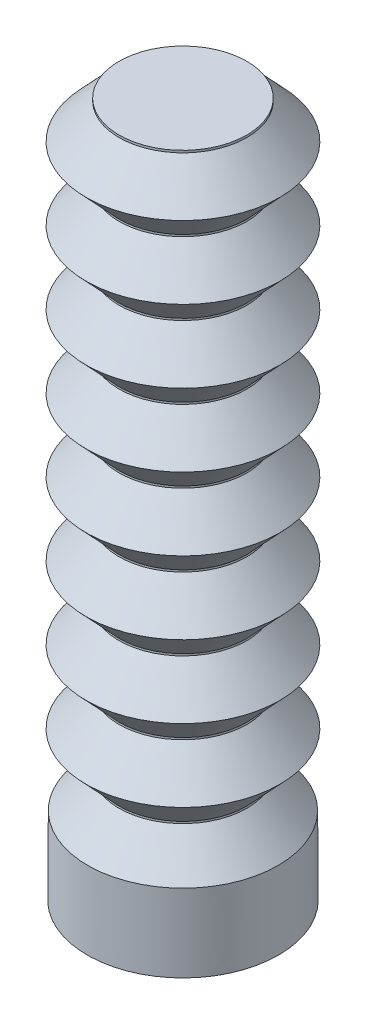
ISO-10303-21;
HEADER;
FILE_DESCRIPTION(('STEP AP214'),'2;1');
FILE_NAME('part.step','',(''),(''),'','','');
FILE_SCHEMA(('AUTOMOTIVE_DESIGN { 1 0 10303 214 1 1 1 1 }'));
ENDSEC;
DATA;
#1=APPLICATION_CONTEXT('core data for automotive mechanical design processes');
#2=APPLICATION_PROTOCOL_DEFINITION('international standard','automotive_design',2000,#1);
#3=PRODUCT_CONTEXT('',#1,'mechanical');
#4=PRODUCT('Part','Part','',(#3));
#5=PRODUCT_RELATED_PRODUCT_CATEGORY('part','',(#4));
#6=PRODUCT_DEFINITION_FORMATION('','',#4);
#7=PRODUCT_DEFINITION_CONTEXT('part definition',#1,'design');
#8=PRODUCT_DEFINITION('design','',#6,#7);
#9=PRODUCT_DEFINITION_SHAPE('','',#8);
#10=(LENGTH_UNIT() NAMED_UNIT(*) SI_UNIT(.MILLI.,.METRE.));
#11=(NAMED_UNIT(*) PLANE_ANGLE_UNIT() SI_UNIT($,.RADIAN.));
#12=(NAMED_UNIT(*) SI_UNIT($,.STERADIAN.) SOLID_ANGLE_UNIT());
#13=UNCERTAINTY_MEASURE_WITH_UNIT(LENGTH_MEASURE(1.E-05),#10,'distance_accuracy_value','');
#14=(GEOMETRIC_REPRESENTATION_CONTEXT(3) GLOBAL_UNCERTAINTY_ASSIGNED_CONTEXT((#13)) GLOBAL_UNIT_ASSIGNED_CONTEXT((#10,
#11,#12)) REPRESENTATION_CONTEXT('',''));
#15=CARTESIAN_POINT('',(0.,0.,0.));
#16=DIRECTION('',(0.,0.,1.));
#17=DIRECTION('',(1.,0.,0.));
#18=AXIS2_PLACEMENT_3D('',#15,#16,#17);
#19=CARTESIAN_POINT('',(-0.490246862964917,-1.75443319236906,0.));
#20=DIRECTION('',(0.,1.,0.));
#21=DIRECTION('',(-1.,0.,0.));
#22=AXIS2_PLACEMENT_3D('',#19,#20,#21);
#23=PLANE('',#22);
#24=CARTESIAN_POINT('',(-5.43163068128709,-1.75443319236906,0.));
#25=DIRECTION('',(0.,-1.,0.));
#26=DIRECTION('',(1.,0.,0.));
#27=AXIS2_PLACEMENT_3D('',#24,#25,#26);
#28=CIRCLE('',#27,4.94138381832217);
#29=CARTESIAN_POINT('',(-0.490246862964917,-1.75443319236906,0.));
#30=VERTEX_POINT('',#29);
#31=EDGE_CURVE('E50',#30,#30,#28,.T.);
#32=ORIENTED_EDGE('',*,*,#31,.T.);
#33=EDGE_LOOP('',(#32));
#34=FACE_BOUND('',#33,.T.);
#35=ADVANCED_FACE('F32',(#34),#23,.F.);
#36=CARTESIAN_POINT('',(-5.43163068128709,2.24550168514075,0.));
#37=DIRECTION('',(0.,-1.,0.));
#38=DIRECTION('',(1.,0.,0.));
#39=AXIS2_PLACEMENT_3D('',#36,#37,#38);
#40=CONICAL_SURFACE('',#39,4.91855892663377,0.00570625388925565);
#41=ORIENTED_EDGE('',*,*,#31,.F.);
#42=EDGE_LOOP('',(#41));
#43=FACE_BOUND('',#42,.T.);
#44=CARTESIAN_POINT('',(-5.43163068128709,2.24550168514075,0.));
#45=DIRECTION('',(0.,-1.,0.));
#46=DIRECTION('',(1.,0.,0.));
#47=AXIS2_PLACEMENT_3D('',#44,#45,#46);
#48=CIRCLE('',#47,4.91855892663377);
#49=CARTESIAN_POINT('',(-0.513071754653318,2.24550168514075,0.));
#50=VERTEX_POINT('',#49);
#51=EDGE_CURVE('E53',#50,#50,#48,.T.);
#52=ORIENTED_EDGE('',*,*,#51,.T.);
#53=EDGE_LOOP('',(#52));
#54=FACE_BOUND('',#53,.T.);
#55=ADVANCED_FACE('F241',(#43,#54),#40,.T.);
#56=CARTESIAN_POINT('',(-5.43163068128709,3.98840953088229,0.));
#57=DIRECTION('',(0.,-1.,0.));
#58=DIRECTION('',(1.,0.,0.));
#59=AXIS2_PLACEMENT_3D('',#56,#57,#58);
#60=CONICAL_SURFACE('',#59,3.30000000000031,0.74842256535505);
#61=ORIENTED_EDGE('',*,*,#51,.F.);
#62=EDGE_LOOP('',(#61));
#63=FACE_BOUND('',#62,.T.);
#64=CARTESIAN_POINT('',(-5.43163068128709,3.98840953088229,0.));
#65=DIRECTION('',(0.,-1.,0.));
#66=DIRECTION('',(1.,0.,0.));
#67=AXIS2_PLACEMENT_3D('',#64,#65,#66);
#68=CIRCLE('',#67,3.30000000000031);
#69=CARTESIAN_POINT('',(-2.13163068128678,3.98840953088229,0.));
#70=VERTEX_POINT('',#69);
#71=EDGE_CURVE('E56',#70,#70,#68,.T.);
#72=ORIENTED_EDGE('',*,*,#71,.T.);
#73=EDGE_LOOP('',(#72));
#74=FACE_BOUND('',#73,.T.);
#75=ADVANCED_FACE('F245',(#63,#74),#60,.T.);
#76=CARTESIAN_POINT('',(-5.43163068128709,34.1029540037317,0.));
#77=DIRECTION('',(0.,-1.,0.));
#78=DIRECTION('',(1.,0.,0.));
#79=AXIS2_PLACEMENT_3D('',#76,#77,#78);
#80=CYLINDRICAL_SURFACE('',#79,3.30000000000029);
#81=ORIENTED_EDGE('',*,*,#71,.F.);
#82=EDGE_LOOP('',(#81));
#83=FACE_BOUND('',#82,.T.);
#84=CARTESIAN_POINT('',(-5.43163068128709,4.08840953088234,0.));
#85=DIRECTION('',(0.,-1.,0.));
#86=DIRECTION('',(1.,0.,0.));
#87=AXIS2_PLACEMENT_3D('',#84,#85,#86);
#88=CIRCLE('',#87,3.30000000000027);
#89=CARTESIAN_POINT('',(-2.13163068128682,4.08840953088234,0.));
#90=VERTEX_POINT('',#89);
#91=EDGE_CURVE('E59',#90,#90,#88,.T.);
#92=ORIENTED_EDGE('',*,*,#91,.T.);
#93=EDGE_LOOP('',(#92));
#94=FACE_BOUND('',#93,.T.);
#95=ADVANCED_FACE('F249',(#83,#94),#80,.T.);
#96=CARTESIAN_POINT('',(-5.43163068128709,5.91340953088234,0.));
#97=DIRECTION('',(0.,1.,0.));
#98=DIRECTION('',(-1.,0.,0.));
#99=AXIS2_PLACEMENT_3D('',#96,#97,#98);
#100=CONICAL_SURFACE('',#99,5.00000000000027,0.749952023138733);
#101=ORIENTED_EDGE('',*,*,#91,.F.);
#102=EDGE_LOOP('',(#101));
#103=FACE_BOUND('',#102,.T.);
#104=CARTESIAN_POINT('',(-5.43163068128709,5.91340953088234,0.));
#105=DIRECTION('',(0.,-1.,0.));
#106=DIRECTION('',(1.,0.,0.));
#107=AXIS2_PLACEMENT_3D('',#104,#105,#106);
#108=CIRCLE('',#107,5.00000000000027);
#109=CARTESIAN_POINT('',(-0.431630681286819,5.91340953088234,0.));
#110=VERTEX_POINT('',#109);
#111=EDGE_CURVE('E62',#110,#110,#108,.T.);
#112=ORIENTED_EDGE('',*,*,#111,.T.);
#113=EDGE_LOOP('',(#112));
#114=FACE_BOUND('',#113,.T.);
#115=ADVANCED_FACE('F253',(#103,#114),#100,.T.);
#116=CARTESIAN_POINT('',(-5.43163068128709,7.73840953088234,0.));
#117=DIRECTION('',(0.,-1.,0.));
#118=DIRECTION('',(1.,0.,0.));
#119=AXIS2_PLACEMENT_3D('',#116,#117,#118);
#120=CONICAL_SURFACE('',#119,3.30000000000027,0.749952023138734);
#121=ORIENTED_EDGE('',*,*,#111,.F.);
#122=EDGE_LOOP('',(#121));
#123=FACE_BOUND('',#122,.T.);
#124=CARTESIAN_POINT('',(-5.43163068128709,7.73840953088234,0.));
#125=DIRECTION('',(0.,-1.,0.));
#126=DIRECTION('',(1.,0.,0.));
#127=AXIS2_PLACEMENT_3D('',#124,#125,#126);
#128=CIRCLE('',#127,3.30000000000027);
#129=CARTESIAN_POINT('',(-2.13163068128682,7.73840953088234,0.));
#130=VERTEX_POINT('',#129);
#131=EDGE_CURVE('E65',#130,#130,#128,.T.);
#132=ORIENTED_EDGE('',*,*,#131,.T.);
#133=EDGE_LOOP('',(#132));
#134=FACE_BOUND('',#133,.T.);
#135=ADVANCED_FACE('F257',(#123,#134),#120,.T.);
#136=CARTESIAN_POINT('',(-5.43163068128709,34.1029540037317,0.));
#137=DIRECTION('',(0.,-1.,0.));
#138=DIRECTION('',(1.,0.,0.));
#139=AXIS2_PLACEMENT_3D('',#136,#137,#138);
#140=CYLINDRICAL_SURFACE('',#139,3.30000000000025);
#141=ORIENTED_EDGE('',*,*,#131,.F.);
#142=EDGE_LOOP('',(#141));
#143=FACE_BOUND('',#142,.T.);
#144=CARTESIAN_POINT('',(-5.43163068128709,7.83840953088238,0.));
#145=DIRECTION('',(0.,-1.,0.));
#146=DIRECTION('',(1.,0.,0.));
#147=AXIS2_PLACEMENT_3D('',#144,#145,#146);
#148=CIRCLE('',#147,3.30000000000023);
#149=CARTESIAN_POINT('',(-2.13163068128686,7.83840953088238,0.));
#150=VERTEX_POINT('',#149);
#151=EDGE_CURVE('E68',#150,#150,#148,.T.);
#152=ORIENTED_EDGE('',*,*,#151,.T.);
#153=EDGE_LOOP('',(#152));
#154=FACE_BOUND('',#153,.T.);
#155=ADVANCED_FACE('F261',(#143,#154),#140,.T.);
#156=CARTESIAN_POINT('',(-5.43163068128709,9.66340953088238,0.));
#157=DIRECTION('',(0.,1.,0.));
#158=DIRECTION('',(-1.,0.,0.));
#159=AXIS2_PLACEMENT_3D('',#156,#157,#158);
#160=CONICAL_SURFACE('',#159,5.00000000000023,0.749952023138734);
#161=ORIENTED_EDGE('',*,*,#151,.F.);
#162=EDGE_LOOP('',(#161));
#163=FACE_BOUND('',#162,.T.);
#164=CARTESIAN_POINT('',(-5.43163068128709,9.66340953088238,0.));
#165=DIRECTION('',(0.,-1.,0.));
#166=DIRECTION('',(1.,0.,0.));
#167=AXIS2_PLACEMENT_3D('',#164,#165,#166);
#168=CIRCLE('',#167,5.00000000000023);
#169=CARTESIAN_POINT('',(-0.431630681286858,9.66340953088238,0.));
#170=VERTEX_POINT('',#169);
#171=EDGE_CURVE('E71',#170,#170,#168,.T.);
#172=ORIENTED_EDGE('',*,*,#171,.T.);
#173=EDGE_LOOP('',(#172));
#174=FACE_BOUND('',#173,.T.);
#175=ADVANCED_FACE('F265',(#163,#174),#160,.T.);
#176=CARTESIAN_POINT('',(-5.43163068128709,11.4884095308824,0.));
#177=DIRECTION('',(0.,-1.,0.));
#178=DIRECTION('',(1.,0.,0.));
#179=AXIS2_PLACEMENT_3D('',#176,#177,#178);
#180=CONICAL_SURFACE('',#179,3.30000000000023,0.749952023138734);
#181=ORIENTED_EDGE('',*,*,#171,.F.);
#182=EDGE_LOOP('',(#181));
#183=FACE_BOUND('',#182,.T.);
#184=CARTESIAN_POINT('',(-5.43163068128709,11.4884095308824,0.));
#185=DIRECTION('',(0.,-1.,0.));
#186=DIRECTION('',(1.,0.,0.));
#187=AXIS2_PLACEMENT_3D('',#184,#185,#186);
#188=CIRCLE('',#187,3.30000000000023);
#189=CARTESIAN_POINT('',(-2.13163068128686,11.4884095308824,0.));
#190=VERTEX_POINT('',#189);
#191=EDGE_CURVE('E74',#190,#190,#188,.T.);
#192=ORIENTED_EDGE('',*,*,#191,.T.);
#193=EDGE_LOOP('',(#192));
#194=FACE_BOUND('',#193,.T.);
#195=ADVANCED_FACE('F269',(#183,#194),#180,.T.);
#196=CARTESIAN_POINT('',(-5.43163068128709,34.1029540037317,0.));
#197=DIRECTION('',(0.,-1.,0.));
#198=DIRECTION('',(1.,0.,0.));
#199=AXIS2_PLACEMENT_3D('',#196,#197,#198);
#200=CYLINDRICAL_SURFACE('',#199,3.30000000000021);
#201=ORIENTED_EDGE('',*,*,#191,.F.);
#202=EDGE_LOOP('',(#201));
#203=FACE_BOUND('',#202,.T.);
#204=CARTESIAN_POINT('',(-5.43163068128709,11.5884095308824,0.));
#205=DIRECTION('',(0.,-1.,0.));
#206=DIRECTION('',(1.,0.,0.));
#207=AXIS2_PLACEMENT_3D('',#204,#205,#206);
#208=CIRCLE('',#207,3.30000000000019);
#209=CARTESIAN_POINT('',(-2.1316306812869,11.5884095308824,0.));
#210=VERTEX_POINT('',#209);
#211=EDGE_CURVE('E77',#210,#210,#208,.T.);
#212=ORIENTED_EDGE('',*,*,#211,.T.);
#213=EDGE_LOOP('',(#212));
#214=FACE_BOUND('',#213,.T.);
#215=ADVANCED_FACE('F273',(#203,#214),#200,.T.);
#216=CARTESIAN_POINT('',(-5.43163068128709,13.4134095308824,0.));
#217=DIRECTION('',(0.,1.,0.));
#218=DIRECTION('',(-1.,0.,0.));
#219=AXIS2_PLACEMENT_3D('',#216,#217,#218);
#220=CONICAL_SURFACE('',#219,5.0000000000002,0.749952023138734);
#221=ORIENTED_EDGE('',*,*,#211,.F.);
#222=EDGE_LOOP('',(#221));
#223=FACE_BOUND('',#222,.T.);
#224=CARTESIAN_POINT('',(-5.43163068128709,13.4134095308824,0.));
#225=DIRECTION('',(0.,-1.,0.));
#226=DIRECTION('',(1.,0.,0.));
#227=AXIS2_PLACEMENT_3D('',#224,#225,#226);
#228=CIRCLE('',#227,5.0000000000002);
#229=CARTESIAN_POINT('',(-0.431630681286897,13.4134095308824,0.));
#230=VERTEX_POINT('',#229);
#231=EDGE_CURVE('E80',#230,#230,#228,.T.);
#232=ORIENTED_EDGE('',*,*,#231,.T.);
#233=EDGE_LOOP('',(#232));
#234=FACE_BOUND('',#233,.T.);
#235=ADVANCED_FACE('F277',(#223,#234),#220,.T.);
#236=CARTESIAN_POINT('',(-5.43163068128709,15.2384095308824,0.));
#237=DIRECTION('',(0.,-1.,0.));
#238=DIRECTION('',(1.,0.,0.));
#239=AXIS2_PLACEMENT_3D('',#236,#237,#238);
#240=CONICAL_SURFACE('',#239,3.30000000000019,0.749952023138734);
#241=ORIENTED_EDGE('',*,*,#231,.F.);
#242=EDGE_LOOP('',(#241));
#243=FACE_BOUND('',#242,.T.);
#244=CARTESIAN_POINT('',(-5.43163068128709,15.2384095308824,0.));
#245=DIRECTION('',(0.,-1.,0.));
#246=DIRECTION('',(1.,0.,0.));
#247=AXIS2_PLACEMENT_3D('',#244,#245,#246);
#248=CIRCLE('',#247,3.30000000000019);
#249=CARTESIAN_POINT('',(-2.1316306812869,15.2384095308824,0.));
#250=VERTEX_POINT('',#249);
#251=EDGE_CURVE('E83',#250,#250,#248,.T.);
#252=ORIENTED_EDGE('',*,*,#251,.T.);
#253=EDGE_LOOP('',(#252));
#254=FACE_BOUND('',#253,.T.);
#255=ADVANCED_FACE('F281',(#243,#254),#240,.T.);
#256=CARTESIAN_POINT('',(-5.43163068128709,34.1029540037317,0.));
#257=DIRECTION('',(0.,-1.,0.));
#258=DIRECTION('',(1.,0.,0.));
#259=AXIS2_PLACEMENT_3D('',#256,#257,#258);
#260=CYLINDRICAL_SURFACE('',#259,3.30000000000018);
#261=ORIENTED_EDGE('',*,*,#251,.F.);
#262=EDGE_LOOP('',(#261));
#263=FACE_BOUND('',#262,.T.);
#264=CARTESIAN_POINT('',(-5.43163068128709,15.3384095308825,0.));
#265=DIRECTION('',(0.,-1.,0.));
#266=DIRECTION('',(1.,0.,0.));
#267=AXIS2_PLACEMENT_3D('',#264,#265,#266);
#268=CIRCLE('',#267,3.30000000000016);
#269=CARTESIAN_POINT('',(-2.13163068128694,15.3384095308825,0.));
#270=VERTEX_POINT('',#269);
#271=EDGE_CURVE('E86',#270,#270,#268,.T.);
#272=ORIENTED_EDGE('',*,*,#271,.T.);
#273=EDGE_LOOP('',(#272));
#274=FACE_BOUND('',#273,.T.);
#275=ADVANCED_FACE('F285',(#263,#274),#260,.T.);
#276=CARTESIAN_POINT('',(-5.43163068128709,17.1634095308825,0.));
#277=DIRECTION('',(0.,1.,0.));
#278=DIRECTION('',(-1.,0.,0.));
#279=AXIS2_PLACEMENT_3D('',#276,#277,#278);
#280=CONICAL_SURFACE('',#279,5.00000000000016,0.749952023138733);
#281=ORIENTED_EDGE('',*,*,#271,.F.);
#282=EDGE_LOOP('',(#281));
#283=FACE_BOUND('',#282,.T.);
#284=CARTESIAN_POINT('',(-5.43163068128709,17.1634095308825,0.));
#285=DIRECTION('',(0.,-1.,0.));
#286=DIRECTION('',(1.,0.,0.));
#287=AXIS2_PLACEMENT_3D('',#284,#285,#286);
#288=CIRCLE('',#287,5.00000000000016);
#289=CARTESIAN_POINT('',(-0.431630681286937,17.1634095308825,0.));
#290=VERTEX_POINT('',#289);
#291=EDGE_CURVE('E89',#290,#290,#288,.T.);
#292=ORIENTED_EDGE('',*,*,#291,.T.);
#293=EDGE_LOOP('',(#292));
#294=FACE_BOUND('',#293,.T.);
#295=ADVANCED_FACE('F289',(#283,#294),#280,.T.);
#296=CARTESIAN_POINT('',(-5.43163068128709,18.9884095308825,0.));
#297=DIRECTION('',(0.,-1.,0.));
#298=DIRECTION('',(1.,0.,0.));
#299=AXIS2_PLACEMENT_3D('',#296,#297,#298);
#300=CONICAL_SURFACE('',#299,3.30000000000016,0.749952023138734);
#301=ORIENTED_EDGE('',*,*,#291,.F.);
#302=EDGE_LOOP('',(#301));
#303=FACE_BOUND('',#302,.T.);
#304=CARTESIAN_POINT('',(-5.43163068128709,18.9884095308825,0.));
#305=DIRECTION('',(0.,-1.,0.));
#306=DIRECTION('',(1.,0.,0.));
#307=AXIS2_PLACEMENT_3D('',#304,#305,#306);
#308=CIRCLE('',#307,3.30000000000016);
#309=CARTESIAN_POINT('',(-2.13163068128694,18.9884095308825,0.));
#310=VERTEX_POINT('',#309);
#311=EDGE_CURVE('E92',#310,#310,#308,.T.);
#312=ORIENTED_EDGE('',*,*,#311,.T.);
#313=EDGE_LOOP('',(#312));
#314=FACE_BOUND('',#313,.T.);
#315=ADVANCED_FACE('F293',(#303,#314),#300,.T.);
#316=CARTESIAN_POINT('',(-5.43163068128709,34.1029540037317,0.));
#317=DIRECTION('',(0.,-1.,0.));
#318=DIRECTION('',(1.,0.,0.));
#319=AXIS2_PLACEMENT_3D('',#316,#317,#318);
#320=CYLINDRICAL_SURFACE('',#319,3.30000000000014);
#321=ORIENTED_EDGE('',*,*,#311,.F.);
#322=EDGE_LOOP('',(#321));
#323=FACE_BOUND('',#322,.T.);
#324=CARTESIAN_POINT('',(-5.43163068128709,19.0884095308825,0.));
#325=DIRECTION('',(0.,-1.,0.));
#326=DIRECTION('',(1.,0.,0.));
#327=AXIS2_PLACEMENT_3D('',#324,#325,#326);
#328=CIRCLE('',#327,3.30000000000012);
#329=CARTESIAN_POINT('',(-2.13163068128698,19.0884095308825,0.));
#330=VERTEX_POINT('',#329);
#331=EDGE_CURVE('E95',#330,#330,#328,.T.);
#332=ORIENTED_EDGE('',*,*,#331,.T.);
#333=EDGE_LOOP('',(#332));
#334=FACE_BOUND('',#333,.T.);
#335=ADVANCED_FACE('F297',(#323,#334),#320,.T.);
#336=CARTESIAN_POINT('',(-5.43163068128709,20.9134095308825,0.));
#337=DIRECTION('',(0.,1.,0.));
#338=DIRECTION('',(-1.,0.,0.));
#339=AXIS2_PLACEMENT_3D('',#336,#337,#338);
#340=CONICAL_SURFACE('',#339,5.00000000000012,0.749952023138733);
#341=ORIENTED_EDGE('',*,*,#331,.F.);
#342=EDGE_LOOP('',(#341));
#343=FACE_BOUND('',#342,.T.);
#344=CARTESIAN_POINT('',(-5.43163068128709,20.9134095308825,0.));
#345=DIRECTION('',(0.,-1.,0.));
#346=DIRECTION('',(1.,0.,0.));
#347=AXIS2_PLACEMENT_3D('',#344,#345,#346);
#348=CIRCLE('',#347,5.00000000000012);
#349=CARTESIAN_POINT('',(-0.431630681286976,20.9134095308825,0.));
#350=VERTEX_POINT('',#349);
#351=EDGE_CURVE('E98',#350,#350,#348,.T.);
#352=ORIENTED_EDGE('',*,*,#351,.T.);
#353=EDGE_LOOP('',(#352));
#354=FACE_BOUND('',#353,.T.);
#355=ADVANCED_FACE('F301',(#343,#354),#340,.T.);
#356=CARTESIAN_POINT('',(-5.43163068128709,22.7384095308825,0.));
#357=DIRECTION('',(0.,-1.,0.));
#358=DIRECTION('',(1.,0.,0.));
#359=AXIS2_PLACEMENT_3D('',#356,#357,#358);
#360=CONICAL_SURFACE('',#359,3.30000000000012,0.749952023138733);
#361=ORIENTED_EDGE('',*,*,#351,.F.);
#362=EDGE_LOOP('',(#361));
#363=FACE_BOUND('',#362,.T.);
#364=CARTESIAN_POINT('',(-5.43163068128709,22.7384095308825,0.));
#365=DIRECTION('',(0.,-1.,0.));
#366=DIRECTION('',(1.,0.,0.));
#367=AXIS2_PLACEMENT_3D('',#364,#365,#366);
#368=CIRCLE('',#367,3.30000000000012);
#369=CARTESIAN_POINT('',(-2.13163068128698,22.7384095308825,0.));
#370=VERTEX_POINT('',#369);
#371=EDGE_CURVE('E101',#370,#370,#368,.T.);
#372=ORIENTED_EDGE('',*,*,#371,.T.);
#373=EDGE_LOOP('',(#372));
#374=FACE_BOUND('',#373,.T.);
#375=ADVANCED_FACE('F305',(#363,#374),#360,.T.);
#376=CARTESIAN_POINT('',(-5.43163068128709,34.1029540037317,0.));
#377=DIRECTION('',(0.,-1.,0.));
#378=DIRECTION('',(1.,0.,0.));
#379=AXIS2_PLACEMENT_3D('',#376,#377,#378);
#380=CYLINDRICAL_SURFACE('',#379,3.3000000000001);
#381=ORIENTED_EDGE('',*,*,#371,.F.);
#382=EDGE_LOOP('',(#381));
#383=FACE_BOUND('',#382,.T.);
#384=CARTESIAN_POINT('',(-5.43163068128709,22.8384095308825,0.));
#385=DIRECTION('',(0.,-1.,0.));
#386=DIRECTION('',(1.,0.,0.));
#387=AXIS2_PLACEMENT_3D('',#384,#385,#386);
#388=CIRCLE('',#387,3.30000000000008);
#389=CARTESIAN_POINT('',(-2.13163068128702,22.8384095308825,0.));
#390=VERTEX_POINT('',#389);
#391=EDGE_CURVE('E104',#390,#390,#388,.T.);
#392=ORIENTED_EDGE('',*,*,#391,.T.);
#393=EDGE_LOOP('',(#392));
#394=FACE_BOUND('',#393,.T.);
#395=ADVANCED_FACE('F309',(#383,#394),#380,.T.);
#396=CARTESIAN_POINT('',(-5.43163068128709,24.6634095308825,0.));
#397=DIRECTION('',(0.,1.,0.));
#398=DIRECTION('',(-1.,0.,0.));
#399=AXIS2_PLACEMENT_3D('',#396,#397,#398);
#400=CONICAL_SURFACE('',#399,5.00000000000008,0.749952023138734);
#401=ORIENTED_EDGE('',*,*,#391,.F.);
#402=EDGE_LOOP('',(#401));
#403=FACE_BOUND('',#402,.T.);
#404=CARTESIAN_POINT('',(-5.43163068128709,24.6634095308825,0.));
#405=DIRECTION('',(0.,-1.,0.));
#406=DIRECTION('',(1.,0.,0.));
#407=AXIS2_PLACEMENT_3D('',#404,#405,#406);
#408=CIRCLE('',#407,5.00000000000008);
#409=CARTESIAN_POINT('',(-0.431630681287015,24.6634095308825,0.));
#410=VERTEX_POINT('',#409);
#411=EDGE_CURVE('E107',#410,#410,#408,.T.);
#412=ORIENTED_EDGE('',*,*,#411,.T.);
#413=EDGE_LOOP('',(#412));
#414=FACE_BOUND('',#413,.T.);
#415=ADVANCED_FACE('F313',(#403,#414),#400,.T.);
#416=CARTESIAN_POINT('',(-5.43163068128709,26.4884095308825,0.));
#417=DIRECTION('',(0.,-1.,0.));
#418=DIRECTION('',(1.,0.,0.));
#419=AXIS2_PLACEMENT_3D('',#416,#417,#418);
#420=CONICAL_SURFACE('',#419,3.30000000000008,0.749952023138734);
#421=ORIENTED_EDGE('',*,*,#411,.F.);
#422=EDGE_LOOP('',(#421));
#423=FACE_BOUND('',#422,.T.);
#424=CARTESIAN_POINT('',(-5.43163068128709,26.4884095308825,0.));
#425=DIRECTION('',(0.,-1.,0.));
#426=DIRECTION('',(1.,0.,0.));
#427=AXIS2_PLACEMENT_3D('',#424,#425,#426);
#428=CIRCLE('',#427,3.30000000000008);
#429=CARTESIAN_POINT('',(-2.13163068128702,26.4884095308825,0.));
#430=VERTEX_POINT('',#429);
#431=EDGE_CURVE('E110',#430,#430,#428,.T.);
#432=ORIENTED_EDGE('',*,*,#431,.T.);
#433=EDGE_LOOP('',(#432));
#434=FACE_BOUND('',#433,.T.);
#435=ADVANCED_FACE('F317',(#423,#434),#420,.T.);
#436=CARTESIAN_POINT('',(-5.43163068128709,34.1029540037317,0.));
#437=DIRECTION('',(0.,-1.,0.));
#438=DIRECTION('',(1.,0.,0.));
#439=AXIS2_PLACEMENT_3D('',#436,#437,#438);
#440=CYLINDRICAL_SURFACE('',#439,3.30000000000006);
#441=ORIENTED_EDGE('',*,*,#431,.F.);
#442=EDGE_LOOP('',(#441));
#443=FACE_BOUND('',#442,.T.);
#444=CARTESIAN_POINT('',(-5.43163068128709,26.5884095308826,0.));
#445=DIRECTION('',(0.,-1.,0.));
#446=DIRECTION('',(1.,0.,0.));
#447=AXIS2_PLACEMENT_3D('',#444,#445,#446);
#448=CIRCLE('',#447,3.30000000000004);
#449=CARTESIAN_POINT('',(-2.13163068128705,26.5884095308826,0.));
#450=VERTEX_POINT('',#449);
#451=EDGE_CURVE('E113',#450,#450,#448,.T.);
#452=ORIENTED_EDGE('',*,*,#451,.T.);
#453=EDGE_LOOP('',(#452));
#454=FACE_BOUND('',#453,.T.);
#455=ADVANCED_FACE('F321',(#443,#454),#440,.T.);
#456=CARTESIAN_POINT('',(-5.43163068128709,28.4134095308826,0.));
#457=DIRECTION('',(0.,1.,0.));
#458=DIRECTION('',(-1.,0.,0.));
#459=AXIS2_PLACEMENT_3D('',#456,#457,#458);
#460=CONICAL_SURFACE('',#459,5.00000000000004,0.749952023138734);
#461=ORIENTED_EDGE('',*,*,#451,.F.);
#462=EDGE_LOOP('',(#461));
#463=FACE_BOUND('',#462,.T.);
#464=CARTESIAN_POINT('',(-5.43163068128709,28.4134095308826,0.));
#465=DIRECTION('',(0.,-1.,0.));
#466=DIRECTION('',(1.,0.,0.));
#467=AXIS2_PLACEMENT_3D('',#464,#465,#466);
#468=CIRCLE('',#467,5.00000000000004);
#469=CARTESIAN_POINT('',(-0.431630681287054,28.4134095308826,0.));
#470=VERTEX_POINT('',#469);
#471=EDGE_CURVE('E116',#470,#470,#468,.T.);
#472=ORIENTED_EDGE('',*,*,#471,.T.);
#473=EDGE_LOOP('',(#472));
#474=FACE_BOUND('',#473,.T.);
#475=ADVANCED_FACE('F325',(#463,#474),#460,.T.);
#476=CARTESIAN_POINT('',(-5.43163068128709,30.2384095308826,0.));
#477=DIRECTION('',(0.,-1.,0.));
#478=DIRECTION('',(1.,0.,0.));
#479=AXIS2_PLACEMENT_3D('',#476,#477,#478);
#480=CONICAL_SURFACE('',#479,3.3,0.749952023138734);
#481=ORIENTED_EDGE('',*,*,#471,.F.);
#482=EDGE_LOOP('',(#481));
#483=FACE_BOUND('',#482,.T.);
#484=CARTESIAN_POINT('',(-5.43163068128709,30.2384095308826,0.));
#485=DIRECTION('',(0.,-1.,0.));
#486=DIRECTION('',(1.,0.,0.));
#487=AXIS2_PLACEMENT_3D('',#484,#485,#486);
#488=CIRCLE('',#487,3.3);
#489=CARTESIAN_POINT('',(-2.13163068128709,30.2384095308826,0.));
#490=VERTEX_POINT('',#489);
#491=EDGE_CURVE('E119',#490,#490,#488,.T.);
#492=ORIENTED_EDGE('',*,*,#491,.T.);
#493=EDGE_LOOP('',(#492));
#494=FACE_BOUND('',#493,.T.);
#495=ADVANCED_FACE('F329',(#483,#494),#480,.T.);
#496=CARTESIAN_POINT('',(-5.43163068128709,34.1029540037317,0.));
#497=DIRECTION('',(0.,-1.,0.));
#498=DIRECTION('',(1.,0.,0.));
#499=AXIS2_PLACEMENT_3D('',#496,#497,#498);
#500=CYLINDRICAL_SURFACE('',#499,3.3);
#501=ORIENTED_EDGE('',*,*,#491,.F.);
#502=EDGE_LOOP('',(#501));
#503=FACE_BOUND('',#502,.T.);
#504=CARTESIAN_POINT('',(-5.43163068128709,30.3384095308826,0.));
#505=DIRECTION('',(0.,-1.,0.));
#506=DIRECTION('',(1.,0.,0.));
#507=AXIS2_PLACEMENT_3D('',#504,#505,#506);
#508=CIRCLE('',#507,3.3);
#509=CARTESIAN_POINT('',(-2.13163068128709,30.3384095308826,0.));
#510=VERTEX_POINT('',#509);
#511=EDGE_CURVE('E122',#510,#510,#508,.T.);
#512=ORIENTED_EDGE('',*,*,#511,.T.);
#513=EDGE_LOOP('',(#512));
#514=FACE_BOUND('',#513,.T.);
#515=ADVANCED_FACE('F333',(#503,#514),#500,.T.);
#516=CARTESIAN_POINT('',(-5.43163068128709,32.1634095308826,0.));
#517=DIRECTION('',(0.,1.,0.));
#518=DIRECTION('',(-1.,0.,0.));
#519=AXIS2_PLACEMENT_3D('',#516,#517,#518);
#520=CONICAL_SURFACE('',#519,5.,0.749952023138734);
#521=ORIENTED_EDGE('',*,*,#511,.F.);
#522=EDGE_LOOP('',(#521));
#523=FACE_BOUND('',#522,.T.);
#524=CARTESIAN_POINT('',(-5.43163068128709,32.1634095308826,0.));
#525=DIRECTION('',(0.,-1.,0.));
#526=DIRECTION('',(1.,0.,0.));
#527=AXIS2_PLACEMENT_3D('',#524,#525,#526);
#528=CIRCLE('',#527,5.);
#529=CARTESIAN_POINT('',(-0.431630681287094,32.1634095308826,0.));
#530=VERTEX_POINT('',#529);
#531=EDGE_CURVE('E125',#530,#530,#528,.T.);
#532=ORIENTED_EDGE('',*,*,#531,.T.);
#533=EDGE_LOOP('',(#532));
#534=FACE_BOUND('',#533,.T.);
#535=ADVANCED_FACE('F337',(#523,#534),#520,.T.);
#536=CARTESIAN_POINT('',(-5.43163068128709,33.9884095308826,0.));
#537=DIRECTION('',(0.,-1.,0.));
#538=DIRECTION('',(1.,0.,0.));
#539=AXIS2_PLACEMENT_3D('',#536,#537,#538);
#540=CONICAL_SURFACE('',#539,3.3,0.749952023138734);
#541=ORIENTED_EDGE('',*,*,#531,.F.);
#542=EDGE_LOOP('',(#541));
#543=FACE_BOUND('',#542,.T.);
#544=CARTESIAN_POINT('',(-5.43163068128709,33.9884095308826,0.));
#545=DIRECTION('',(0.,-1.,0.));
#546=DIRECTION('',(1.,0.,0.));
#547=AXIS2_PLACEMENT_3D('',#544,#545,#546);
#548=CIRCLE('',#547,3.3);
#549=CARTESIAN_POINT('',(-2.13163068128709,33.9884095308826,0.));
#550=VERTEX_POINT('',#549);
#551=EDGE_CURVE('E127',#550,#550,#548,.T.);
#552=ORIENTED_EDGE('',*,*,#551,.T.);
#553=EDGE_LOOP('',(#552));
#554=FACE_BOUND('',#553,.T.);
#555=ADVANCED_FACE('F341',(#543,#554),#540,.T.);
#556=CARTESIAN_POINT('',(-5.43163068128709,34.1029540037317,0.));
#557=DIRECTION('',(0.,-1.,0.));
#558=DIRECTION('',(1.,0.,0.));
#559=AXIS2_PLACEMENT_3D('',#556,#557,#558);
#560=CYLINDRICAL_SURFACE('',#559,3.3);
#561=ORIENTED_EDGE('',*,*,#551,.F.);
#562=EDGE_LOOP('',(#561));
#563=FACE_BOUND('',#562,.T.);
#564=CARTESIAN_POINT('',(-5.43163068128709,34.1029540037317,0.));
#565=DIRECTION('',(0.,-1.,0.));
#566=DIRECTION('',(1.,0.,0.));
#567=AXIS2_PLACEMENT_3D('',#564,#565,#566);
#568=CIRCLE('',#567,3.3);
#569=CARTESIAN_POINT('',(-2.13163068128709,34.1029540037317,0.));
#570=VERTEX_POINT('',#569);
#571=EDGE_CURVE('E36',#570,#570,#568,.T.);
#572=ORIENTED_EDGE('',*,*,#571,.T.);
#573=EDGE_LOOP('',(#572));
#574=FACE_BOUND('',#573,.T.);
#575=ADVANCED_FACE('F344',(#563,#574),#560,.T.);
#576=CARTESIAN_POINT('',(-2.13163068128709,34.1029540037317,0.));
#577=DIRECTION('',(0.,-1.,0.));
#578=DIRECTION('',(1.,0.,0.));
#579=AXIS2_PLACEMENT_3D('',#576,#577,#578);
#580=PLANE('',#579);
#581=ORIENTED_EDGE('',*,*,#571,.F.);
#582=EDGE_LOOP('',(#581));
#583=FACE_BOUND('',#582,.T.);
#584=ADVANCED_FACE('F34',(#583),#580,.F.);
#585=CLOSED_SHELL('',(#35,#55,#75,#95,#115,#135,#155,#175,#195,#215,#235,#255,#275,#295,#315,
#335,#355,#375,#395,#415,#435,#455,#475,#495,#515,#535,#555,#575,#584));
#586=CARTESIAN_POINT('',(-0.490246862964917,-0.95443319236906,0.));
#587=DIRECTION('',(0.,1.,0.));
#588=DIRECTION('',(-1.,0.,0.));
#589=AXIS2_PLACEMENT_3D('',#586,#587,#588);
#590=PLANE('',#589);
#591=CARTESIAN_POINT('',(-5.43163068128709,-0.954433192369061,0.));
#592=DIRECTION('',(0.,1.,0.));
#593=DIRECTION('',(-1.,0.,0.));
#594=AXIS2_PLACEMENT_3D('',#591,#592,#593);
#595=CIRCLE('',#594,4.13680574095251);
#596=CARTESIAN_POINT('',(-9.5684364222396,-0.954433192369061,0.));
#597=VERTEX_POINT('',#596);
#598=EDGE_CURVE('E132',#597,#597,#595,.F.);
#599=ORIENTED_EDGE('',*,*,#598,.F.);
#600=EDGE_LOOP('',(#599));
#601=FACE_BOUND('',#600,.T.);
#602=ADVANCED_FACE('F229',(#601),#590,.T.);
#603=CARTESIAN_POINT('',(-5.43163068128709,2.24093670680307,0.));
#604=DIRECTION('',(0.,-1.,0.));
#605=DIRECTION('',(1.,0.,0.));
#606=AXIS2_PLACEMENT_3D('',#603,#604,#605);
#607=CONICAL_SURFACE('',#606,4.11857195113181,0.00570625388925565);
#608=ORIENTED_EDGE('',*,*,#598,.T.);
#609=EDGE_LOOP('',(#608));
#610=FACE_BOUND('',#609,.T.);
#611=CARTESIAN_POINT('',(-5.43163068128709,1.92940061099429,0.));
#612=DIRECTION('',(0.,-1.,0.));
#613=DIRECTION('',(1.,0.,0.));
#614=AXIS2_PLACEMENT_3D('',#611,#612,#613);
#615=CIRCLE('',#614,4.12034967448522);
#616=CARTESIAN_POINT('',(-1.31128100680187,1.92940061099429,0.));
#617=VERTEX_POINT('',#616);
#618=EDGE_CURVE('E136',#617,#617,#615,.T.);
#619=ORIENTED_EDGE('',*,*,#618,.F.);
#620=EDGE_LOOP('',(#619));
#621=FACE_BOUND('',#620,.T.);
#622=ADVANCED_FACE('F360',(#610,#621),#607,.F.);
#623=CARTESIAN_POINT('',(-5.43163068128709,3.44402255402613,0.));
#624=DIRECTION('',(0.,-1.,0.));
#625=DIRECTION('',(1.,0.,0.));
#626=AXIS2_PLACEMENT_3D('',#623,#624,#625);
#627=CONICAL_SURFACE('',#626,2.7137894410461,0.74842256535505);
#628=ORIENTED_EDGE('',*,*,#618,.T.);
#629=EDGE_LOOP('',(#628));
#630=FACE_BOUND('',#629,.T.);
#631=CARTESIAN_POINT('',(-5.43163068128709,3.6742367822535,0.));
#632=DIRECTION('',(0.,-1.,0.));
#633=DIRECTION('',(1.,0.,0.));
#634=AXIS2_PLACEMENT_3D('',#631,#632,#633);
#635=CIRCLE('',#634,2.50000000000029);
#636=CARTESIAN_POINT('',(-2.9316306812868,3.6742367822535,0.));
#637=VERTEX_POINT('',#636);
#638=EDGE_CURVE('E141',#637,#637,#635,.T.);
#639=ORIENTED_EDGE('',*,*,#638,.F.);
#640=EDGE_LOOP('',(#639));
#641=FACE_BOUND('',#640,.T.);
#642=ADVANCED_FACE('F368',(#630,#641),#627,.F.);
#643=CARTESIAN_POINT('',(-5.43163068128709,34.1029540037317,0.));
#644=DIRECTION('',(0.,-1.,0.));
#645=DIRECTION('',(1.,0.,0.));
#646=AXIS2_PLACEMENT_3D('',#643,#644,#645);
#647=CYLINDRICAL_SURFACE('',#646,2.50000000000029);
#648=ORIENTED_EDGE('',*,*,#638,.T.);
#649=EDGE_LOOP('',(#648));
#650=FACE_BOUND('',#649,.T.);
#651=CARTESIAN_POINT('',(-5.43163068128709,4.40328862763758,0.));
#652=DIRECTION('',(0.,1.,0.));
#653=DIRECTION('',(-1.,0.,0.));
#654=AXIS2_PLACEMENT_3D('',#651,#652,#653);
#655=CIRCLE('',#654,2.50000000000029);
#656=CARTESIAN_POINT('',(-7.93163068128738,4.40328862763758,0.));
#657=VERTEX_POINT('',#656);
#658=EDGE_CURVE('E146',#657,#657,#655,.F.);
#659=ORIENTED_EDGE('',*,*,#658,.F.);
#660=EDGE_LOOP('',(#659));
#661=FACE_BOUND('',#660,.T.);
#662=ADVANCED_FACE('F375',(#650,#661),#647,.F.);
#663=CARTESIAN_POINT('',(-5.43163068128709,6.45869245496514,0.));
#664=DIRECTION('',(0.,1.,0.));
#665=DIRECTION('',(-1.,0.,0.));
#666=AXIS2_PLACEMENT_3D('',#663,#664,#665);
#667=CONICAL_SURFACE('',#666,4.41462274326432,0.749952023138733);
#668=ORIENTED_EDGE('',*,*,#658,.T.);
#669=EDGE_LOOP('',(#668));
#670=FACE_BOUND('',#669,.T.);
#671=CARTESIAN_POINT('',(-5.43163068128709,5.91340953088234,0.));
#672=DIRECTION('',(0.,-1.,0.));
#673=DIRECTION('',(1.,0.,0.));
#674=AXIS2_PLACEMENT_3D('',#671,#672,#673);
#675=CIRCLE('',#674,3.90668796466664);
#676=CARTESIAN_POINT('',(-1.52494271662045,5.91340953088234,0.));
#677=VERTEX_POINT('',#676);
#678=EDGE_CURVE('E149',#677,#677,#675,.T.);
#679=ORIENTED_EDGE('',*,*,#678,.F.);
#680=EDGE_LOOP('',(#679));
#681=FACE_BOUND('',#680,.T.);
#682=ADVANCED_FACE('F383',(#670,#681),#667,.F.);
#683=CARTESIAN_POINT('',(-5.43163068128709,7.19312660679953,0.));
#684=DIRECTION('',(0.,-1.,0.));
#685=DIRECTION('',(1.,0.,0.));
#686=AXIS2_PLACEMENT_3D('',#683,#684,#685);
#687=CONICAL_SURFACE('',#686,2.71462274326432,0.749952023138734);
#688=ORIENTED_EDGE('',*,*,#678,.T.);
#689=EDGE_LOOP('',(#688));
#690=FACE_BOUND('',#689,.T.);
#691=CARTESIAN_POINT('',(-5.43163068128709,7.42353043412714,0.));
#692=DIRECTION('',(0.,-1.,0.));
#693=DIRECTION('',(1.,0.,0.));
#694=AXIS2_PLACEMENT_3D('',#691,#692,#693);
#695=CIRCLE('',#694,2.50000000000025);
#696=CARTESIAN_POINT('',(-2.93163068128684,7.42353043412714,0.));
#697=VERTEX_POINT('',#696);
#698=EDGE_CURVE('E152',#697,#697,#695,.T.);
#699=ORIENTED_EDGE('',*,*,#698,.F.);
#700=EDGE_LOOP('',(#699));
#701=FACE_BOUND('',#700,.T.);
#702=ADVANCED_FACE('F391',(#690,#701),#687,.F.);
#703=CARTESIAN_POINT('',(-5.43163068128709,34.1029540037317,0.));
#704=DIRECTION('',(0.,-1.,0.));
#705=DIRECTION('',(1.,0.,0.));
#706=AXIS2_PLACEMENT_3D('',#703,#704,#705);
#707=CYLINDRICAL_SURFACE('',#706,2.50000000000025);
#708=ORIENTED_EDGE('',*,*,#698,.T.);
#709=EDGE_LOOP('',(#708));
#710=FACE_BOUND('',#709,.T.);
#711=CARTESIAN_POINT('',(-5.43163068128709,8.15328862763762,0.));
#712=DIRECTION('',(0.,1.,0.));
#713=DIRECTION('',(-1.,0.,0.));
#714=AXIS2_PLACEMENT_3D('',#711,#712,#713);
#715=CIRCLE('',#714,2.50000000000025);
#716=CARTESIAN_POINT('',(-7.93163068128734,8.15328862763762,0.));
#717=VERTEX_POINT('',#716);
#718=EDGE_CURVE('E155',#717,#717,#715,.F.);
#719=ORIENTED_EDGE('',*,*,#718,.F.);
#720=EDGE_LOOP('',(#719));
#721=FACE_BOUND('',#720,.T.);
#722=ADVANCED_FACE('F399',(#710,#721),#707,.F.);
#723=CARTESIAN_POINT('',(-5.43163068128709,10.2086924549652,0.));
#724=DIRECTION('',(0.,1.,0.));
#725=DIRECTION('',(-1.,0.,0.));
#726=AXIS2_PLACEMENT_3D('',#723,#724,#725);
#727=CONICAL_SURFACE('',#726,4.41462274326428,0.749952023138734);
#728=ORIENTED_EDGE('',*,*,#718,.T.);
#729=EDGE_LOOP('',(#728));
#730=FACE_BOUND('',#729,.T.);
#731=CARTESIAN_POINT('',(-5.43163068128709,9.66340953088238,0.));
#732=DIRECTION('',(0.,-1.,0.));
#733=DIRECTION('',(1.,0.,0.));
#734=AXIS2_PLACEMENT_3D('',#731,#732,#733);
#735=CIRCLE('',#734,3.9066879646666);
#736=CARTESIAN_POINT('',(-1.52494271662049,9.66340953088238,0.));
#737=VERTEX_POINT('',#736);
#738=EDGE_CURVE('E158',#737,#737,#735,.T.);
#739=ORIENTED_EDGE('',*,*,#738,.F.);
#740=EDGE_LOOP('',(#739));
#741=FACE_BOUND('',#740,.T.);
#742=ADVANCED_FACE('F407',(#730,#741),#727,.F.);
#743=CARTESIAN_POINT('',(-5.43163068128709,10.9431266067996,0.));
#744=DIRECTION('',(0.,-1.,0.));
#745=DIRECTION('',(1.,0.,0.));
#746=AXIS2_PLACEMENT_3D('',#743,#744,#745);
#747=CONICAL_SURFACE('',#746,2.71462274326428,0.749952023138734);
#748=ORIENTED_EDGE('',*,*,#738,.T.);
#749=EDGE_LOOP('',(#748));
#750=FACE_BOUND('',#749,.T.);
#751=CARTESIAN_POINT('',(-5.43163068128709,11.1735304341272,0.));
#752=DIRECTION('',(0.,-1.,0.));
#753=DIRECTION('',(1.,0.,0.));
#754=AXIS2_PLACEMENT_3D('',#751,#752,#753);
#755=CIRCLE('',#754,2.50000000000021);
#756=CARTESIAN_POINT('',(-2.93163068128688,11.1735304341272,0.));
#757=VERTEX_POINT('',#756);
#758=EDGE_CURVE('E161',#757,#757,#755,.T.);
#759=ORIENTED_EDGE('',*,*,#758,.F.);
#760=EDGE_LOOP('',(#759));
#761=FACE_BOUND('',#760,.T.);
#762=ADVANCED_FACE('F415',(#750,#761),#747,.F.);
#763=CARTESIAN_POINT('',(-5.43163068128709,34.1029540037317,0.));
#764=DIRECTION('',(0.,-1.,0.));
#765=DIRECTION('',(1.,0.,0.));
#766=AXIS2_PLACEMENT_3D('',#763,#764,#765);
#767=CYLINDRICAL_SURFACE('',#766,2.50000000000021);
#768=ORIENTED_EDGE('',*,*,#758,.T.);
#769=EDGE_LOOP('',(#768));
#770=FACE_BOUND('',#769,.T.);
#771=CARTESIAN_POINT('',(-5.43163068128709,11.9032886276377,0.));
#772=DIRECTION('',(0.,1.,0.));
#773=DIRECTION('',(-1.,0.,0.));
#774=AXIS2_PLACEMENT_3D('',#771,#772,#773);
#775=CIRCLE('',#774,2.50000000000021);
#776=CARTESIAN_POINT('',(-7.93163068128731,11.9032886276377,0.));
#777=VERTEX_POINT('',#776);
#778=EDGE_CURVE('E164',#777,#777,#775,.F.);
#779=ORIENTED_EDGE('',*,*,#778,.F.);
#780=EDGE_LOOP('',(#779));
#781=FACE_BOUND('',#780,.T.);
#782=ADVANCED_FACE('F423',(#770,#781),#767,.F.);
#783=CARTESIAN_POINT('',(-5.43163068128709,13.9586924549652,0.));
#784=DIRECTION('',(0.,1.,0.));
#785=DIRECTION('',(-1.,0.,0.));
#786=AXIS2_PLACEMENT_3D('',#783,#784,#785);
#787=CONICAL_SURFACE('',#786,4.41462274326424,0.749952023138734);
#788=ORIENTED_EDGE('',*,*,#778,.T.);
#789=EDGE_LOOP('',(#788));
#790=FACE_BOUND('',#789,.T.);
#791=CARTESIAN_POINT('',(-5.43163068128709,13.4134095308824,0.));
#792=DIRECTION('',(0.,-1.,0.));
#793=DIRECTION('',(1.,0.,0.));
#794=AXIS2_PLACEMENT_3D('',#791,#792,#793);
#795=CIRCLE('',#794,3.90668796466656);
#796=CARTESIAN_POINT('',(-1.52494271662053,13.4134095308824,0.));
#797=VERTEX_POINT('',#796);
#798=EDGE_CURVE('E167',#797,#797,#795,.T.);
#799=ORIENTED_EDGE('',*,*,#798,.F.);
#800=EDGE_LOOP('',(#799));
#801=FACE_BOUND('',#800,.T.);
#802=ADVANCED_FACE('F431',(#790,#801),#787,.F.);
#803=CARTESIAN_POINT('',(-5.43163068128709,14.6931266067996,0.));
#804=DIRECTION('',(0.,-1.,0.));
#805=DIRECTION('',(1.,0.,0.));
#806=AXIS2_PLACEMENT_3D('',#803,#804,#805);
#807=CONICAL_SURFACE('',#806,2.71462274326424,0.749952023138734);
#808=ORIENTED_EDGE('',*,*,#798,.T.);
#809=EDGE_LOOP('',(#808));
#810=FACE_BOUND('',#809,.T.);
#811=CARTESIAN_POINT('',(-5.43163068128709,14.9235304341272,0.));
#812=DIRECTION('',(0.,-1.,0.));
#813=DIRECTION('',(1.,0.,0.));
#814=AXIS2_PLACEMENT_3D('',#811,#812,#813);
#815=CIRCLE('',#814,2.50000000000018);
#816=CARTESIAN_POINT('',(-2.93163068128692,14.9235304341272,0.));
#817=VERTEX_POINT('',#816);
#818=EDGE_CURVE('E170',#817,#817,#815,.T.);
#819=ORIENTED_EDGE('',*,*,#818,.F.);
#820=EDGE_LOOP('',(#819));
#821=FACE_BOUND('',#820,.T.);
#822=ADVANCED_FACE('F439',(#810,#821),#807,.F.);
#823=CARTESIAN_POINT('',(-5.43163068128709,34.1029540037317,0.));
#824=DIRECTION('',(0.,-1.,0.));
#825=DIRECTION('',(1.,0.,0.));
#826=AXIS2_PLACEMENT_3D('',#823,#824,#825);
#827=CYLINDRICAL_SURFACE('',#826,2.50000000000018);
#828=ORIENTED_EDGE('',*,*,#818,.T.);
#829=EDGE_LOOP('',(#828));
#830=FACE_BOUND('',#829,.T.);
#831=CARTESIAN_POINT('',(-5.43163068128709,15.6532886276377,0.));
#832=DIRECTION('',(0.,1.,0.));
#833=DIRECTION('',(-1.,0.,0.));
#834=AXIS2_PLACEMENT_3D('',#831,#832,#833);
#835=CIRCLE('',#834,2.50000000000018);
#836=CARTESIAN_POINT('',(-7.93163068128727,15.6532886276377,0.));
#837=VERTEX_POINT('',#836);
#838=EDGE_CURVE('E173',#837,#837,#835,.F.);
#839=ORIENTED_EDGE('',*,*,#838,.F.);
#840=EDGE_LOOP('',(#839));
#841=FACE_BOUND('',#840,.T.);
#842=ADVANCED_FACE('F447',(#830,#841),#827,.F.);
#843=CARTESIAN_POINT('',(-5.43163068128709,17.7086924549653,0.));
#844=DIRECTION('',(0.,1.,0.));
#845=DIRECTION('',(-1.,0.,0.));
#846=AXIS2_PLACEMENT_3D('',#843,#844,#845);
#847=CONICAL_SURFACE('',#846,4.4146227432642,0.749952023138733);
#848=ORIENTED_EDGE('',*,*,#838,.T.);
#849=EDGE_LOOP('',(#848));
#850=FACE_BOUND('',#849,.T.);
#851=CARTESIAN_POINT('',(-5.43163068128709,17.1634095308825,0.));
#852=DIRECTION('',(0.,-1.,0.));
#853=DIRECTION('',(1.,0.,0.));
#854=AXIS2_PLACEMENT_3D('',#851,#852,#853);
#855=CIRCLE('',#854,3.90668796466652);
#856=CARTESIAN_POINT('',(-1.52494271662057,17.1634095308825,0.));
#857=VERTEX_POINT('',#856);
#858=EDGE_CURVE('E176',#857,#857,#855,.T.);
#859=ORIENTED_EDGE('',*,*,#858,.F.);
#860=EDGE_LOOP('',(#859));
#861=FACE_BOUND('',#860,.T.);
#862=ADVANCED_FACE('F455',(#850,#861),#847,.F.);
#863=CARTESIAN_POINT('',(-5.43163068128709,18.4431266067997,0.));
#864=DIRECTION('',(0.,-1.,0.));
#865=DIRECTION('',(1.,0.,0.));
#866=AXIS2_PLACEMENT_3D('',#863,#864,#865);
#867=CONICAL_SURFACE('',#866,2.7146227432642,0.749952023138734);
#868=ORIENTED_EDGE('',*,*,#858,.T.);
#869=EDGE_LOOP('',(#868));
#870=FACE_BOUND('',#869,.T.);
#871=CARTESIAN_POINT('',(-5.43163068128709,18.6735304341273,0.));
#872=DIRECTION('',(0.,-1.,0.));
#873=DIRECTION('',(1.,0.,0.));
#874=AXIS2_PLACEMENT_3D('',#871,#872,#873);
#875=CIRCLE('',#874,2.50000000000014);
#876=CARTESIAN_POINT('',(-2.93163068128696,18.6735304341273,0.));
#877=VERTEX_POINT('',#876);
#878=EDGE_CURVE('E179',#877,#877,#875,.T.);
#879=ORIENTED_EDGE('',*,*,#878,.F.);
#880=EDGE_LOOP('',(#879));
#881=FACE_BOUND('',#880,.T.);
#882=ADVANCED_FACE('F463',(#870,#881),#867,.F.);
#883=CARTESIAN_POINT('',(-5.43163068128709,34.1029540037317,0.));
#884=DIRECTION('',(0.,-1.,0.));
#885=DIRECTION('',(1.,0.,0.));
#886=AXIS2_PLACEMENT_3D('',#883,#884,#885);
#887=CYLINDRICAL_SURFACE('',#886,2.50000000000014);
#888=ORIENTED_EDGE('',*,*,#878,.T.);
#889=EDGE_LOOP('',(#888));
#890=FACE_BOUND('',#889,.T.);
#891=CARTESIAN_POINT('',(-5.43163068128709,19.4032886276377,0.));
#892=DIRECTION('',(0.,1.,0.));
#893=DIRECTION('',(-1.,0.,0.));
#894=AXIS2_PLACEMENT_3D('',#891,#892,#893);
#895=CIRCLE('',#894,2.50000000000014);
#896=CARTESIAN_POINT('',(-7.93163068128723,19.4032886276377,0.));
#897=VERTEX_POINT('',#896);
#898=EDGE_CURVE('E182',#897,#897,#895,.F.);
#899=ORIENTED_EDGE('',*,*,#898,.F.);
#900=EDGE_LOOP('',(#899));
#901=FACE_BOUND('',#900,.T.);
#902=ADVANCED_FACE('F471',(#890,#901),#887,.F.);
#903=CARTESIAN_POINT('',(-5.43163068128709,21.4586924549653,0.));
#904=DIRECTION('',(0.,1.,0.));
#905=DIRECTION('',(-1.,0.,0.));
#906=AXIS2_PLACEMENT_3D('',#903,#904,#905);
#907=CONICAL_SURFACE('',#906,4.41462274326417,0.749952023138733);
#908=ORIENTED_EDGE('',*,*,#898,.T.);
#909=EDGE_LOOP('',(#908));
#910=FACE_BOUND('',#909,.T.);
#911=CARTESIAN_POINT('',(-5.43163068128709,20.9134095308825,0.));
#912=DIRECTION('',(0.,-1.,0.));
#913=DIRECTION('',(1.,0.,0.));
#914=AXIS2_PLACEMENT_3D('',#911,#912,#913);
#915=CIRCLE('',#914,3.90668796466648);
#916=CARTESIAN_POINT('',(-1.52494271662061,20.9134095308825,0.));
#917=VERTEX_POINT('',#916);
#918=EDGE_CURVE('E185',#917,#917,#915,.T.);
#919=ORIENTED_EDGE('',*,*,#918,.F.);
#920=EDGE_LOOP('',(#919));
#921=FACE_BOUND('',#920,.T.);
#922=ADVANCED_FACE('F479',(#910,#921),#907,.F.);
#923=CARTESIAN_POINT('',(-5.43163068128709,22.1931266067997,0.));
#924=DIRECTION('',(0.,-1.,0.));
#925=DIRECTION('',(1.,0.,0.));
#926=AXIS2_PLACEMENT_3D('',#923,#924,#925);
#927=CONICAL_SURFACE('',#926,2.71462274326417,0.749952023138733);
#928=ORIENTED_EDGE('',*,*,#918,.T.);
#929=EDGE_LOOP('',(#928));
#930=FACE_BOUND('',#929,.T.);
#931=CARTESIAN_POINT('',(-5.43163068128709,22.4235304341273,0.));
#932=DIRECTION('',(0.,-1.,0.));
#933=DIRECTION('',(1.,0.,0.));
#934=AXIS2_PLACEMENT_3D('',#931,#932,#933);
#935=CIRCLE('',#934,2.5000000000001);
#936=CARTESIAN_POINT('',(-2.931630681287,22.4235304341273,0.));
#937=VERTEX_POINT('',#936);
#938=EDGE_CURVE('E188',#937,#937,#935,.T.);
#939=ORIENTED_EDGE('',*,*,#938,.F.);
#940=EDGE_LOOP('',(#939));
#941=FACE_BOUND('',#940,.T.);
#942=ADVANCED_FACE('F487',(#930,#941),#927,.F.);
#943=CARTESIAN_POINT('',(-5.43163068128709,34.1029540037317,0.));
#944=DIRECTION('',(0.,-1.,0.));
#945=DIRECTION('',(1.,0.,0.));
#946=AXIS2_PLACEMENT_3D('',#943,#944,#945);
#947=CYLINDRICAL_SURFACE('',#946,2.5000000000001);
#948=ORIENTED_EDGE('',*,*,#938,.T.);
#949=EDGE_LOOP('',(#948));
#950=FACE_BOUND('',#949,.T.);
#951=CARTESIAN_POINT('',(-5.43163068128709,23.1532886276378,0.));
#952=DIRECTION('',(0.,1.,0.));
#953=DIRECTION('',(-1.,0.,0.));
#954=AXIS2_PLACEMENT_3D('',#951,#952,#953);
#955=CIRCLE('',#954,2.5000000000001);
#956=CARTESIAN_POINT('',(-7.93163068128719,23.1532886276378,0.));
#957=VERTEX_POINT('',#956);
#958=EDGE_CURVE('E191',#957,#957,#955,.F.);
#959=ORIENTED_EDGE('',*,*,#958,.F.);
#960=EDGE_LOOP('',(#959));
#961=FACE_BOUND('',#960,.T.);
#962=ADVANCED_FACE('F495',(#950,#961),#947,.F.);
#963=CARTESIAN_POINT('',(-5.43163068128709,25.2086924549653,0.));
#964=DIRECTION('',(0.,1.,0.));
#965=DIRECTION('',(-1.,0.,0.));
#966=AXIS2_PLACEMENT_3D('',#963,#964,#965);
#967=CONICAL_SURFACE('',#966,4.41462274326413,0.749952023138734);
#968=ORIENTED_EDGE('',*,*,#958,.T.);
#969=EDGE_LOOP('',(#968));
#970=FACE_BOUND('',#969,.T.);
#971=CARTESIAN_POINT('',(-5.43163068128709,24.6634095308825,0.));
#972=DIRECTION('',(0.,-1.,0.));
#973=DIRECTION('',(1.,0.,0.));
#974=AXIS2_PLACEMENT_3D('',#971,#972,#973);
#975=CIRCLE('',#974,3.90668796466645);
#976=CARTESIAN_POINT('',(-1.52494271662064,24.6634095308825,0.));
#977=VERTEX_POINT('',#976);
#978=EDGE_CURVE('E194',#977,#977,#975,.T.);
#979=ORIENTED_EDGE('',*,*,#978,.F.);
#980=EDGE_LOOP('',(#979));
#981=FACE_BOUND('',#980,.T.);
#982=ADVANCED_FACE('F503',(#970,#981),#967,.F.);
#983=CARTESIAN_POINT('',(-5.43163068128709,25.9431266067997,0.));
#984=DIRECTION('',(0.,-1.,0.));
#985=DIRECTION('',(1.,0.,0.));
#986=AXIS2_PLACEMENT_3D('',#983,#984,#985);
#987=CONICAL_SURFACE('',#986,2.71462274326413,0.749952023138734);
#988=ORIENTED_EDGE('',*,*,#978,.T.);
#989=EDGE_LOOP('',(#988));
#990=FACE_BOUND('',#989,.T.);
#991=CARTESIAN_POINT('',(-5.43163068128709,26.1735304341273,0.));
#992=DIRECTION('',(0.,-1.,0.));
#993=DIRECTION('',(1.,0.,0.));
#994=AXIS2_PLACEMENT_3D('',#991,#992,#993);
#995=CIRCLE('',#994,2.50000000000006);
#996=CARTESIAN_POINT('',(-2.93163068128704,26.1735304341273,0.));
#997=VERTEX_POINT('',#996);
#998=EDGE_CURVE('E197',#997,#997,#995,.T.);
#999=ORIENTED_EDGE('',*,*,#998,.F.);
#1000=EDGE_LOOP('',(#999));
#1001=FACE_BOUND('',#1000,.T.);
#1002=ADVANCED_FACE('F511',(#990,#1001),#987,.F.);
#1003=CARTESIAN_POINT('',(-5.43163068128709,34.1029540037317,0.));
#1004=DIRECTION('',(0.,-1.,0.));
#1005=DIRECTION('',(1.,0.,0.));
#1006=AXIS2_PLACEMENT_3D('',#1003,#1004,#1005);
#1007=CYLINDRICAL_SURFACE('',#1006,2.50000000000006);
#1008=ORIENTED_EDGE('',*,*,#998,.T.);
#1009=EDGE_LOOP('',(#1008));
#1010=FACE_BOUND('',#1009,.T.);
#1011=CARTESIAN_POINT('',(-5.43163068128709,26.9032886276378,0.));
#1012=DIRECTION('',(0.,1.,0.));
#1013=DIRECTION('',(-1.,0.,0.));
#1014=AXIS2_PLACEMENT_3D('',#1011,#1012,#1013);
#1015=CIRCLE('',#1014,2.50000000000006);
#1016=CARTESIAN_POINT('',(-7.93163068128715,26.9032886276378,0.));
#1017=VERTEX_POINT('',#1016);
#1018=EDGE_CURVE('E200',#1017,#1017,#1015,.F.);
#1019=ORIENTED_EDGE('',*,*,#1018,.F.);
#1020=EDGE_LOOP('',(#1019));
#1021=FACE_BOUND('',#1020,.T.);
#1022=ADVANCED_FACE('F519',(#1010,#1021),#1007,.F.);
#1023=CARTESIAN_POINT('',(-5.43163068128709,28.9586924549654,0.));
#1024=DIRECTION('',(0.,1.,0.));
#1025=DIRECTION('',(-1.,0.,0.));
#1026=AXIS2_PLACEMENT_3D('',#1023,#1024,#1025);
#1027=CONICAL_SURFACE('',#1026,4.41462274326409,0.749952023138734);
#1028=ORIENTED_EDGE('',*,*,#1018,.T.);
#1029=EDGE_LOOP('',(#1028));
#1030=FACE_BOUND('',#1029,.T.);
#1031=CARTESIAN_POINT('',(-5.43163068128709,28.4134095308826,0.));
#1032=DIRECTION('',(0.,-1.,0.));
#1033=DIRECTION('',(1.,0.,0.));
#1034=AXIS2_PLACEMENT_3D('',#1031,#1032,#1033);
#1035=CIRCLE('',#1034,3.90668796466641);
#1036=CARTESIAN_POINT('',(-1.52494271662068,28.4134095308826,0.));
#1037=VERTEX_POINT('',#1036);
#1038=EDGE_CURVE('E203',#1037,#1037,#1035,.T.);
#1039=ORIENTED_EDGE('',*,*,#1038,.F.);
#1040=EDGE_LOOP('',(#1039));
#1041=FACE_BOUND('',#1040,.T.);
#1042=ADVANCED_FACE('F226',(#1030,#1041),#1027,.F.);
#1043=CARTESIAN_POINT('',(-5.43163068128709,29.6931266067998,0.));
#1044=DIRECTION('',(0.,-1.,0.));
#1045=DIRECTION('',(1.,0.,0.));
#1046=AXIS2_PLACEMENT_3D('',#1043,#1044,#1045);
#1047=CONICAL_SURFACE('',#1046,2.71462274326405,0.749952023138734);
#1048=ORIENTED_EDGE('',*,*,#1038,.T.);
#1049=EDGE_LOOP('',(#1048));
#1050=FACE_BOUND('',#1049,.T.);
#1051=CARTESIAN_POINT('',(-5.43163068128709,29.9235304341274,0.));
#1052=DIRECTION('',(0.,-1.,0.));
#1053=DIRECTION('',(1.,0.,0.));
#1054=AXIS2_PLACEMENT_3D('',#1051,#1052,#1053);
#1055=CIRCLE('',#1054,2.5);
#1056=CARTESIAN_POINT('',(-2.93163068128709,29.9235304341274,0.));
#1057=VERTEX_POINT('',#1056);
#1058=EDGE_CURVE('E206',#1057,#1057,#1055,.T.);
#1059=ORIENTED_EDGE('',*,*,#1058,.F.);
#1060=EDGE_LOOP('',(#1059));
#1061=FACE_BOUND('',#1060,.T.);
#1062=ADVANCED_FACE('F216',(#1050,#1061),#1047,.F.);
#1063=CARTESIAN_POINT('',(-5.43163068128709,34.1029540037317,0.));
#1064=DIRECTION('',(0.,-1.,0.));
#1065=DIRECTION('',(1.,0.,0.));
#1066=AXIS2_PLACEMENT_3D('',#1063,#1064,#1065);
#1067=CYLINDRICAL_SURFACE('',#1066,2.5);
#1068=ORIENTED_EDGE('',*,*,#1058,.T.);
#1069=EDGE_LOOP('',(#1068));
#1070=FACE_BOUND('',#1069,.T.);
#1071=CARTESIAN_POINT('',(-5.43163068128709,30.6532886276378,0.));
#1072=DIRECTION('',(0.,1.,0.));
#1073=DIRECTION('',(-1.,0.,0.));
#1074=AXIS2_PLACEMENT_3D('',#1071,#1072,#1073);
#1075=CIRCLE('',#1074,2.5);
#1076=CARTESIAN_POINT('',(-7.93163068128709,30.6532886276378,0.));
#1077=VERTEX_POINT('',#1076);
#1078=EDGE_CURVE('E46',#1077,#1077,#1075,.F.);
#1079=ORIENTED_EDGE('',*,*,#1078,.F.);
#1080=EDGE_LOOP('',(#1079));
#1081=FACE_BOUND('',#1080,.T.);
#1082=ADVANCED_FACE('F214',(#1070,#1081),#1067,.F.);
#1083=CARTESIAN_POINT('',(-5.43163068128709,32.7086924549654,0.));
#1084=DIRECTION('',(0.,1.,0.));
#1085=DIRECTION('',(-1.,0.,0.));
#1086=AXIS2_PLACEMENT_3D('',#1083,#1084,#1085);
#1087=CONICAL_SURFACE('',#1086,4.41462274326405,0.749952023138734);
#1088=ORIENTED_EDGE('',*,*,#1078,.T.);
#1089=EDGE_LOOP('',(#1088));
#1090=FACE_BOUND('',#1089,.T.);
#1091=CARTESIAN_POINT('',(-5.43163068128709,32.1634095308826,0.));
#1092=DIRECTION('',(0.,-1.,0.));
#1093=DIRECTION('',(1.,0.,0.));
#1094=AXIS2_PLACEMENT_3D('',#1091,#1092,#1093);
#1095=CIRCLE('',#1094,3.90668796466637);
#1096=CARTESIAN_POINT('',(-1.52494271662073,32.1634095308826,0.));
#1097=VERTEX_POINT('',#1096);
#1098=EDGE_CURVE('E41',#1097,#1097,#1095,.T.);
#1099=ORIENTED_EDGE('',*,*,#1098,.F.);
#1100=EDGE_LOOP('',(#1099));
#1101=FACE_BOUND('',#1100,.T.);
#1102=ADVANCED_FACE('F211',(#1090,#1101),#1087,.F.);
#1103=CARTESIAN_POINT('',(-5.43163068128709,33.4431266067998,0.));
#1104=DIRECTION('',(0.,-1.,0.));
#1105=DIRECTION('',(1.,0.,0.));
#1106=AXIS2_PLACEMENT_3D('',#1103,#1104,#1105);
#1107=CONICAL_SURFACE('',#1106,2.71462274326405,0.749952023138734);
#1108=ORIENTED_EDGE('',*,*,#1098,.T.);
#1109=EDGE_LOOP('',(#1108));
#1110=FACE_BOUND('',#1109,.T.);
#1111=CARTESIAN_POINT('',(-5.43163068128709,33.3029540037317,0.));
#1112=DIRECTION('',(0.,-1.,0.));
#1113=DIRECTION('',(1.,0.,0.));
#1114=AXIS2_PLACEMENT_3D('',#1111,#1112,#1113);
#1115=CIRCLE('',#1114,2.84519448310834);
#1116=CARTESIAN_POINT('',(-2.58643619817875,33.3029540037317,0.));
#1117=VERTEX_POINT('',#1116);
#1118=EDGE_CURVE('E10',#1117,#1117,#1115,.T.);
#1119=ORIENTED_EDGE('',*,*,#1118,.F.);
#1120=EDGE_LOOP('',(#1119));
#1121=FACE_BOUND('',#1120,.T.);
#1122=ADVANCED_FACE('F224',(#1110,#1121),#1107,.F.);
#1123=CARTESIAN_POINT('',(-2.13163068128709,33.3029540037317,0.));
#1124=DIRECTION('',(0.,-1.,0.));
#1125=DIRECTION('',(1.,0.,0.));
#1126=AXIS2_PLACEMENT_3D('',#1123,#1124,#1125);
#1127=PLANE('',#1126);
#1128=ORIENTED_EDGE('',*,*,#1118,.T.);
#1129=EDGE_LOOP('',(#1128));
#1130=FACE_BOUND('',#1129,.T.);
#1131=ADVANCED_FACE('F230',(#1130),#1127,.T.);
#1132=CLOSED_SHELL('',(#602,#622,#642,#662,#682,#702,#722,#742,#762,#782,#802,#822,#842,#862,
#882,#902,#922,#942,#962,#982,#1002,#1022,#1042,#1062,#1082,#1102,#1122,#1131));
#1133=ORIENTED_CLOSED_SHELL('',*,#1132,.T.);
#1134=BREP_WITH_VOIDS('B2',#585,(#1133));
#1135=ADVANCED_BREP_SHAPE_REPRESENTATION('',(#18,#1134),#14);
#1136=SHAPE_DEFINITION_REPRESENTATION(#9,#1135);
ENDSEC;
END-ISO-10303-21;
